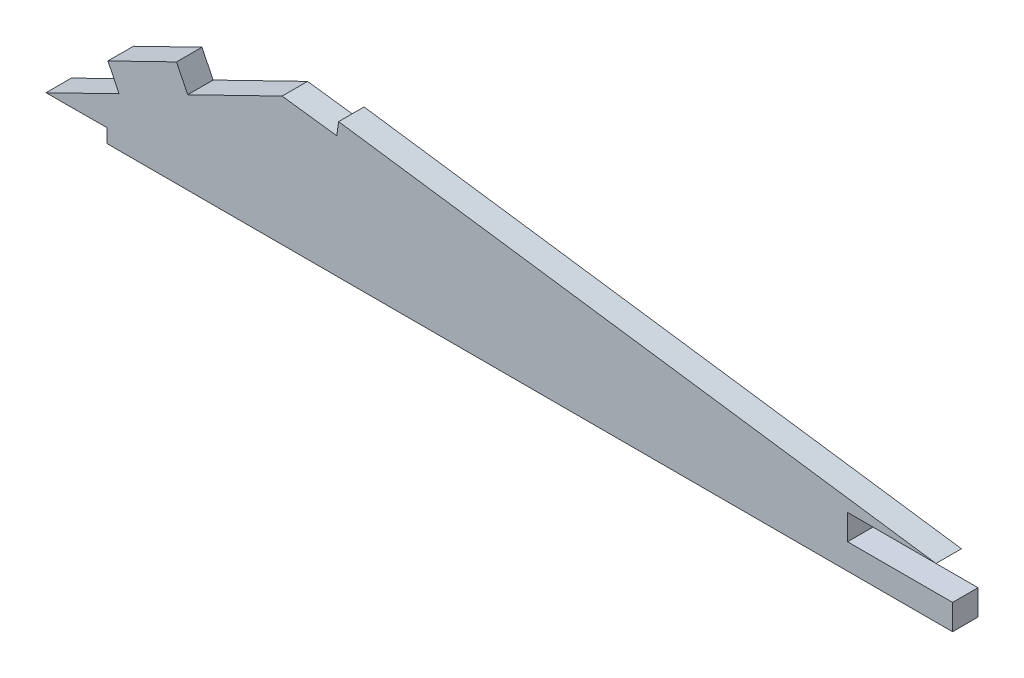
ISO-10303-21;
HEADER;
FILE_DESCRIPTION(('STEP AP214'),'2;1');
FILE_NAME('part.step','',(''),(''),'','','');
FILE_SCHEMA(('AUTOMOTIVE_DESIGN { 1 0 10303 214 1 1 1 1 }'));
ENDSEC;
DATA;
#1=APPLICATION_CONTEXT('core data for automotive mechanical design processes');
#2=APPLICATION_PROTOCOL_DEFINITION('international standard','automotive_design',2000,#1);
#3=PRODUCT_CONTEXT('',#1,'mechanical');
#4=PRODUCT('Part','Part','',(#3));
#5=PRODUCT_RELATED_PRODUCT_CATEGORY('part','',(#4));
#6=PRODUCT_DEFINITION_FORMATION('','',#4);
#7=PRODUCT_DEFINITION_CONTEXT('part definition',#1,'design');
#8=PRODUCT_DEFINITION('design','',#6,#7);
#9=PRODUCT_DEFINITION_SHAPE('','',#8);
#10=(LENGTH_UNIT() NAMED_UNIT(*) SI_UNIT(.MILLI.,.METRE.));
#11=(NAMED_UNIT(*) PLANE_ANGLE_UNIT() SI_UNIT($,.RADIAN.));
#12=(NAMED_UNIT(*) SI_UNIT($,.STERADIAN.) SOLID_ANGLE_UNIT());
#13=UNCERTAINTY_MEASURE_WITH_UNIT(LENGTH_MEASURE(1.E-05),#10,'distance_accuracy_value','');
#14=(GEOMETRIC_REPRESENTATION_CONTEXT(3) GLOBAL_UNCERTAINTY_ASSIGNED_CONTEXT((#13)) GLOBAL_UNIT_ASSIGNED_CONTEXT((#10,
#11,#12)) REPRESENTATION_CONTEXT('',''));
#15=CARTESIAN_POINT('',(0.,0.,0.));
#16=DIRECTION('',(0.,0.,1.));
#17=DIRECTION('',(1.,0.,0.));
#18=AXIS2_PLACEMENT_3D('',#15,#16,#17);
#19=CARTESIAN_POINT('',(7.7559861183291,7.19399602365428,2.));
#20=DIRECTION('',(0.438371146789037,-0.898794046299187,0.));
#21=DIRECTION('',(0.898794046299187,0.438371146789037,0.));
#22=AXIS2_PLACEMENT_3D('',#19,#20,#21);
#23=PLANE('',#22);
#24=DIRECTION('',(-0.898794046299187,-0.438371146789037,0.));
#25=VECTOR('',#24,1.);
#26=CARTESIAN_POINT('',(7.7559861183291,7.19399602365428,0.));
#27=LINE('',#26,#25);
#28=CARTESIAN_POINT('',(7.7559861183291,7.19399602365428,0.));
#29=VERTEX_POINT('',#28);
#30=CARTESIAN_POINT('',(2.0109844537902,4.39197149049386,0.));
#31=VERTEX_POINT('',#30);
#32=EDGE_CURVE('E172',#29,#31,#27,.T.);
#33=ORIENTED_EDGE('',*,*,#32,.T.);
#34=DIRECTION('',(0.,0.,-1.));
#35=VECTOR('',#34,1.);
#36=CARTESIAN_POINT('',(2.0109844537902,4.39197149049386,2.));
#37=LINE('',#36,#35);
#38=CARTESIAN_POINT('',(2.0109844537902,4.39197149049386,2.));
#39=VERTEX_POINT('',#38);
#40=EDGE_CURVE('E11',#39,#31,#37,.T.);
#41=ORIENTED_EDGE('',*,*,#40,.F.);
#42=DIRECTION('',(-0.898794046299187,-0.438371146789037,0.));
#43=VECTOR('',#42,1.);
#44=CARTESIAN_POINT('',(7.7559861183291,7.19399602365428,2.));
#45=LINE('',#44,#43);
#46=CARTESIAN_POINT('',(7.7559861183291,7.19399602365428,2.));
#47=VERTEX_POINT('',#46);
#48=EDGE_CURVE('E200',#47,#39,#45,.T.);
#49=ORIENTED_EDGE('',*,*,#48,.F.);
#50=DIRECTION('',(0.,0.,-1.));
#51=VECTOR('',#50,1.);
#52=CARTESIAN_POINT('',(7.7559861183291,7.19399602365428,2.));
#53=LINE('',#52,#51);
#54=EDGE_CURVE('E168',#47,#29,#53,.T.);
#55=ORIENTED_EDGE('',*,*,#54,.T.);
#56=EDGE_LOOP('',(#33,#41,#49,#55));
#57=FACE_BOUND('',#56,.T.);
#58=ADVANCED_FACE('F34',(#57),#23,.F.);
#59=CARTESIAN_POINT('',(6.79245025203826,4.41052776166242,2.));
#60=DIRECTION('',(-0.00388084579359947,0.999992469489609,0.));
#61=DIRECTION('',(-0.999992469489609,-0.00388084579359947,0.));
#62=AXIS2_PLACEMENT_3D('',#59,#60,#61);
#63=PLANE('',#62);
#64=DIRECTION('',(0.999992469489609,0.00388084579359947,0.));
#65=VECTOR('',#64,1.);
#66=CARTESIAN_POINT('',(6.79245025203826,4.41052776166242,0.));
#67=LINE('',#66,#65);
#68=CARTESIAN_POINT('',(6.79245025203826,4.41052776166242,0.));
#69=VERTEX_POINT('',#68);
#70=EDGE_CURVE('E175',#31,#69,#67,.T.);
#71=ORIENTED_EDGE('',*,*,#70,.T.);
#72=DIRECTION('',(0.,0.,-1.));
#73=VECTOR('',#72,1.);
#74=CARTESIAN_POINT('',(6.79245025203826,4.41052776166242,2.));
#75=LINE('',#74,#73);
#76=CARTESIAN_POINT('',(6.79245025203826,4.41052776166242,2.));
#77=VERTEX_POINT('',#76);
#78=EDGE_CURVE('E42',#77,#69,#75,.T.);
#79=ORIENTED_EDGE('',*,*,#78,.F.);
#80=DIRECTION('',(0.999992469489609,0.00388084579359947,0.));
#81=VECTOR('',#80,1.);
#82=CARTESIAN_POINT('',(6.79245025203826,4.41052776166242,2.));
#83=LINE('',#82,#81);
#84=EDGE_CURVE('E114',#39,#77,#83,.T.);
#85=ORIENTED_EDGE('',*,*,#84,.F.);
#86=ORIENTED_EDGE('',*,*,#40,.T.);
#87=EDGE_LOOP('',(#71,#79,#85,#86));
#88=FACE_BOUND('',#87,.T.);
#89=ADVANCED_FACE('F293',(#88),#63,.F.);
#90=CARTESIAN_POINT('',(6.79665387650502,3.32736366883972,2.));
#91=DIRECTION('',(0.999992469489616,0.00388084579166815,0.));
#92=DIRECTION('',(-0.00388084579166815,0.999992469489616,0.));
#93=AXIS2_PLACEMENT_3D('',#90,#91,#92);
#94=PLANE('',#93);
#95=DIRECTION('',(0.00388084579166815,-0.999992469489616,0.));
#96=VECTOR('',#95,1.);
#97=CARTESIAN_POINT('',(6.79665387650502,3.32736366883972,0.));
#98=LINE('',#97,#96);
#99=CARTESIAN_POINT('',(6.79665387650502,3.32736366883972,0.));
#100=VERTEX_POINT('',#99);
#101=EDGE_CURVE('E177',#69,#100,#98,.T.);
#102=ORIENTED_EDGE('',*,*,#101,.T.);
#103=DIRECTION('',(0.,0.,-1.));
#104=VECTOR('',#103,1.);
#105=CARTESIAN_POINT('',(6.79665387650502,3.32736366883972,2.));
#106=LINE('',#105,#104);
#107=CARTESIAN_POINT('',(6.79665387650502,3.32736366883972,2.));
#108=VERTEX_POINT('',#107);
#109=EDGE_CURVE('E228',#108,#100,#106,.T.);
#110=ORIENTED_EDGE('',*,*,#109,.F.);
#111=DIRECTION('',(0.00388084579166815,-0.999992469489616,0.));
#112=VECTOR('',#111,1.);
#113=CARTESIAN_POINT('',(6.79665387650502,3.32736366883972,2.));
#114=LINE('',#113,#112);
#115=EDGE_CURVE('E236',#77,#108,#114,.T.);
#116=ORIENTED_EDGE('',*,*,#115,.F.);
#117=ORIENTED_EDGE('',*,*,#78,.T.);
#118=EDGE_LOOP('',(#102,#110,#116,#117));
#119=FACE_BOUND('',#118,.T.);
#120=ADVANCED_FACE('F234',(#119),#94,.F.);
#121=CARTESIAN_POINT('',(6.79665387650502,3.32736366883972,2.));
#122=DIRECTION('',(0.,1.,0.));
#123=DIRECTION('',(0.,0.,1.));
#124=AXIS2_PLACEMENT_3D('',#121,#122,#123);
#125=PLANE('',#124);
#126=DIRECTION('',(1.,0.,0.));
#127=VECTOR('',#126,1.);
#128=CARTESIAN_POINT('',(6.79665387650502,3.32736366883972,0.));
#129=LINE('',#128,#127);
#130=CARTESIAN_POINT('',(73.2781243524124,3.32736366883972,0.));
#131=VERTEX_POINT('',#130);
#132=EDGE_CURVE('E179',#100,#131,#129,.T.);
#133=ORIENTED_EDGE('',*,*,#132,.T.);
#134=DIRECTION('',(0.,0.,-1.));
#135=VECTOR('',#134,1.);
#136=CARTESIAN_POINT('',(73.2781243524124,3.32736366883972,2.));
#137=LINE('',#136,#135);
#138=CARTESIAN_POINT('',(73.2781243524124,3.32736366883972,2.));
#139=VERTEX_POINT('',#138);
#140=EDGE_CURVE('E225',#139,#131,#137,.T.);
#141=ORIENTED_EDGE('',*,*,#140,.F.);
#142=DIRECTION('',(1.,0.,0.));
#143=VECTOR('',#142,1.);
#144=CARTESIAN_POINT('',(6.79665387650502,3.32736366883972,2.));
#145=LINE('',#144,#143);
#146=EDGE_CURVE('E254',#108,#139,#145,.T.);
#147=ORIENTED_EDGE('',*,*,#146,.F.);
#148=ORIENTED_EDGE('',*,*,#109,.T.);
#149=EDGE_LOOP('',(#133,#141,#147,#148));
#150=FACE_BOUND('',#149,.T.);
#151=ADVANCED_FACE('F245',(#150),#125,.F.);
#152=CARTESIAN_POINT('',(73.2781243524124,3.32736366883972,2.));
#153=DIRECTION('',(-1.,0.,0.));
#154=DIRECTION('',(0.,0.,1.));
#155=AXIS2_PLACEMENT_3D('',#152,#153,#154);
#156=PLANE('',#155);
#157=DIRECTION('',(0.,1.,0.));
#158=VECTOR('',#157,1.);
#159=CARTESIAN_POINT('',(73.2781243524124,3.32736366883972,0.));
#160=LINE('',#159,#158);
#161=CARTESIAN_POINT('',(73.2781243524124,5.32736366883972,0.));
#162=VERTEX_POINT('',#161);
#163=EDGE_CURVE('E181',#131,#162,#160,.T.);
#164=ORIENTED_EDGE('',*,*,#163,.T.);
#165=DIRECTION('',(0.,0.,-1.));
#166=VECTOR('',#165,1.);
#167=CARTESIAN_POINT('',(73.2781243524124,5.32736366883972,2.));
#168=LINE('',#167,#166);
#169=CARTESIAN_POINT('',(73.2781243524124,5.32736366883972,2.));
#170=VERTEX_POINT('',#169);
#171=EDGE_CURVE('E222',#170,#162,#168,.T.);
#172=ORIENTED_EDGE('',*,*,#171,.F.);
#173=DIRECTION('',(0.,1.,0.));
#174=VECTOR('',#173,1.);
#175=CARTESIAN_POINT('',(73.2781243524124,3.32736366883972,2.));
#176=LINE('',#175,#174);
#177=EDGE_CURVE('E251',#139,#170,#176,.T.);
#178=ORIENTED_EDGE('',*,*,#177,.F.);
#179=ORIENTED_EDGE('',*,*,#140,.T.);
#180=EDGE_LOOP('',(#164,#172,#178,#179));
#181=FACE_BOUND('',#180,.T.);
#182=ADVANCED_FACE('F249',(#181),#156,.F.);
#183=CARTESIAN_POINT('',(65.0219479564304,5.32736366883972,2.));
#184=DIRECTION('',(0.,-1.,0.));
#185=DIRECTION('',(0.,0.,-1.));
#186=AXIS2_PLACEMENT_3D('',#183,#184,#185);
#187=PLANE('',#186);
#188=DIRECTION('',(-1.,0.,0.));
#189=VECTOR('',#188,1.);
#190=CARTESIAN_POINT('',(65.0219479564304,5.32736366883972,0.));
#191=LINE('',#190,#189);
#192=CARTESIAN_POINT('',(65.0219479564304,5.32736366883972,0.));
#193=VERTEX_POINT('',#192);
#194=EDGE_CURVE('E183',#162,#193,#191,.T.);
#195=ORIENTED_EDGE('',*,*,#194,.T.);
#196=DIRECTION('',(0.,0.,-1.));
#197=VECTOR('',#196,1.);
#198=CARTESIAN_POINT('',(65.0219479564304,5.32736366883972,2.));
#199=LINE('',#198,#197);
#200=CARTESIAN_POINT('',(65.0219479564304,5.32736366883972,2.));
#201=VERTEX_POINT('',#200);
#202=EDGE_CURVE('E219',#201,#193,#199,.T.);
#203=ORIENTED_EDGE('',*,*,#202,.F.);
#204=DIRECTION('',(-1.,0.,0.));
#205=VECTOR('',#204,1.);
#206=CARTESIAN_POINT('',(65.0219479564304,5.32736366883972,2.));
#207=LINE('',#206,#205);
#208=EDGE_CURVE('E253',#170,#201,#207,.T.);
#209=ORIENTED_EDGE('',*,*,#208,.F.);
#210=ORIENTED_EDGE('',*,*,#171,.T.);
#211=EDGE_LOOP('',(#195,#203,#209,#210));
#212=FACE_BOUND('',#211,.T.);
#213=ADVANCED_FACE('F306',(#212),#187,.F.);
#214=CARTESIAN_POINT('',(65.0219479564304,5.32736366883972,2.));
#215=DIRECTION('',(-1.,0.,0.));
#216=DIRECTION('',(0.,0.,1.));
#217=AXIS2_PLACEMENT_3D('',#214,#215,#216);
#218=PLANE('',#217);
#219=DIRECTION('',(0.,1.,0.));
#220=VECTOR('',#219,1.);
#221=CARTESIAN_POINT('',(65.0219479564304,5.32736366883972,0.));
#222=LINE('',#221,#220);
#223=CARTESIAN_POINT('',(65.0219479564304,7.32736366884063,0.));
#224=VERTEX_POINT('',#223);
#225=EDGE_CURVE('E185',#193,#224,#222,.T.);
#226=ORIENTED_EDGE('',*,*,#225,.T.);
#227=DIRECTION('',(0.,0.,-1.));
#228=VECTOR('',#227,1.);
#229=CARTESIAN_POINT('',(65.0219479564304,7.32736366884063,2.));
#230=LINE('',#229,#228);
#231=CARTESIAN_POINT('',(65.0219479564304,7.32736366884063,2.));
#232=VERTEX_POINT('',#231);
#233=EDGE_CURVE('E216',#232,#224,#230,.T.);
#234=ORIENTED_EDGE('',*,*,#233,.F.);
#235=DIRECTION('',(0.,1.,0.));
#236=VECTOR('',#235,1.);
#237=CARTESIAN_POINT('',(65.0219479564304,5.32736366883972,2.));
#238=LINE('',#237,#236);
#239=EDGE_CURVE('E256',#201,#232,#238,.T.);
#240=ORIENTED_EDGE('',*,*,#239,.F.);
#241=ORIENTED_EDGE('',*,*,#202,.T.);
#242=EDGE_LOOP('',(#226,#234,#240,#241));
#243=FACE_BOUND('',#242,.T.);
#244=ADVANCED_FACE('F309',(#243),#218,.F.);
#245=CARTESIAN_POINT('',(65.0219479564304,7.32736366884063,2.));
#246=DIRECTION('',(0.,1.,0.));
#247=DIRECTION('',(0.,0.,1.));
#248=AXIS2_PLACEMENT_3D('',#245,#246,#247);
#249=PLANE('',#248);
#250=DIRECTION('',(1.,0.,0.));
#251=VECTOR('',#250,1.);
#252=CARTESIAN_POINT('',(65.0219479564304,7.32736366884063,0.));
#253=LINE('',#252,#251);
#254=CARTESIAN_POINT('',(71.9762860323582,7.32736366884063,0.));
#255=VERTEX_POINT('',#254);
#256=EDGE_CURVE('E187',#224,#255,#253,.T.);
#257=ORIENTED_EDGE('',*,*,#256,.T.);
#258=DIRECTION('',(0.,0.,-1.));
#259=VECTOR('',#258,1.);
#260=CARTESIAN_POINT('',(71.9762860323582,7.32736366884063,2.));
#261=LINE('',#260,#259);
#262=CARTESIAN_POINT('',(71.9762860323582,7.32736366884063,2.));
#263=VERTEX_POINT('',#262);
#264=EDGE_CURVE('E213',#263,#255,#261,.T.);
#265=ORIENTED_EDGE('',*,*,#264,.F.);
#266=DIRECTION('',(1.,0.,0.));
#267=VECTOR('',#266,1.);
#268=CARTESIAN_POINT('',(65.0219479564304,7.32736366884063,2.));
#269=LINE('',#268,#267);
#270=EDGE_CURVE('E262',#232,#263,#269,.T.);
#271=ORIENTED_EDGE('',*,*,#270,.F.);
#272=ORIENTED_EDGE('',*,*,#233,.T.);
#273=EDGE_LOOP('',(#257,#265,#271,#272));
#274=FACE_BOUND('',#273,.T.);
#275=ADVANCED_FACE('F313',(#274),#249,.F.);
#276=CARTESIAN_POINT('',(25.0150673189929,13.9273325454594,2.));
#277=DIRECTION('',(-0.139173100960082,-0.990268068741568,0.));
#278=DIRECTION('',(0.990268068741568,-0.139173100960082,0.));
#279=AXIS2_PLACEMENT_3D('',#276,#277,#278);
#280=PLANE('',#279);
#281=DIRECTION('',(-0.990268068741568,0.139173100960082,0.));
#282=VECTOR('',#281,1.);
#283=CARTESIAN_POINT('',(25.0150673189929,13.9273325454594,0.));
#284=LINE('',#283,#282);
#285=CARTESIAN_POINT('',(25.0150673189929,13.9273325454594,0.));
#286=VERTEX_POINT('',#285);
#287=EDGE_CURVE('E189',#255,#286,#284,.T.);
#288=ORIENTED_EDGE('',*,*,#287,.T.);
#289=DIRECTION('',(0.,0.,-1.));
#290=VECTOR('',#289,1.);
#291=CARTESIAN_POINT('',(25.0150673189929,13.9273325454594,2.));
#292=LINE('',#291,#290);
#293=CARTESIAN_POINT('',(25.0150673189929,13.9273325454594,2.));
#294=VERTEX_POINT('',#293);
#295=EDGE_CURVE('E210',#294,#286,#292,.T.);
#296=ORIENTED_EDGE('',*,*,#295,.F.);
#297=DIRECTION('',(-0.990268068741568,0.139173100960082,0.));
#298=VECTOR('',#297,1.);
#299=CARTESIAN_POINT('',(25.0150673189929,13.9273325454594,2.));
#300=LINE('',#299,#298);
#301=EDGE_CURVE('E264',#263,#294,#300,.T.);
#302=ORIENTED_EDGE('',*,*,#301,.F.);
#303=ORIENTED_EDGE('',*,*,#264,.T.);
#304=EDGE_LOOP('',(#288,#296,#302,#303));
#305=FACE_BOUND('',#304,.T.);
#306=ADVANCED_FACE('F317',(#305),#280,.F.);
#307=CARTESIAN_POINT('',(24.8668572662019,12.8896402880047,2.));
#308=DIRECTION('',(0.98995372681901,-0.141391720963968,0.));
#309=DIRECTION('',(0.141391720963968,0.98995372681901,0.));
#310=AXIS2_PLACEMENT_3D('',#307,#308,#309);
#311=PLANE('',#310);
#312=DIRECTION('',(-0.141391720963968,-0.98995372681901,0.));
#313=VECTOR('',#312,1.);
#314=CARTESIAN_POINT('',(24.8668572662019,12.8896402880047,0.));
#315=LINE('',#314,#313);
#316=CARTESIAN_POINT('',(24.8668572662019,12.8896402880047,0.));
#317=VERTEX_POINT('',#316);
#318=EDGE_CURVE('E191',#286,#317,#315,.T.);
#319=ORIENTED_EDGE('',*,*,#318,.T.);
#320=DIRECTION('',(0.,0.,-1.));
#321=VECTOR('',#320,1.);
#322=CARTESIAN_POINT('',(24.8668572662019,12.8896402880047,2.));
#323=LINE('',#322,#321);
#324=CARTESIAN_POINT('',(24.8668572662019,12.8896402880047,2.));
#325=VERTEX_POINT('',#324);
#326=EDGE_CURVE('E207',#325,#317,#323,.T.);
#327=ORIENTED_EDGE('',*,*,#326,.F.);
#328=DIRECTION('',(-0.141391720963968,-0.98995372681901,0.));
#329=VECTOR('',#328,1.);
#330=CARTESIAN_POINT('',(24.8668572662019,12.8896402880047,2.));
#331=LINE('',#330,#329);
#332=EDGE_CURVE('E266',#294,#325,#331,.T.);
#333=ORIENTED_EDGE('',*,*,#332,.F.);
#334=ORIENTED_EDGE('',*,*,#295,.T.);
#335=EDGE_LOOP('',(#319,#327,#333,#334));
#336=FACE_BOUND('',#335,.T.);
#337=ADVANCED_FACE('F321',(#336),#311,.F.);
#338=CARTESIAN_POINT('',(20.5726316428309,13.4450917220517,2.));
#339=DIRECTION('',(-0.128279776916158,-0.991738019254249,0.));
#340=DIRECTION('',(0.991738019254249,-0.128279776916158,0.));
#341=AXIS2_PLACEMENT_3D('',#338,#339,#340);
#342=PLANE('',#341);
#343=DIRECTION('',(-0.991738019254249,0.128279776916158,0.));
#344=VECTOR('',#343,1.);
#345=CARTESIAN_POINT('',(20.5726316428309,13.4450917220517,0.));
#346=LINE('',#345,#344);
#347=CARTESIAN_POINT('',(20.5726316428309,13.4450917220517,0.));
#348=VERTEX_POINT('',#347);
#349=EDGE_CURVE('E193',#317,#348,#346,.T.);
#350=ORIENTED_EDGE('',*,*,#349,.T.);
#351=DIRECTION('',(0.,0.,-1.));
#352=VECTOR('',#351,1.);
#353=CARTESIAN_POINT('',(20.5726316428309,13.4450917220517,2.));
#354=LINE('',#353,#352);
#355=CARTESIAN_POINT('',(20.5726316428309,13.4450917220517,2.));
#356=VERTEX_POINT('',#355);
#357=EDGE_CURVE('E204',#356,#348,#354,.T.);
#358=ORIENTED_EDGE('',*,*,#357,.F.);
#359=DIRECTION('',(-0.991738019254249,0.128279776916158,0.));
#360=VECTOR('',#359,1.);
#361=CARTESIAN_POINT('',(20.5726316428309,13.4450917220517,2.));
#362=LINE('',#361,#360);
#363=EDGE_CURVE('E268',#325,#356,#362,.T.);
#364=ORIENTED_EDGE('',*,*,#363,.F.);
#365=ORIENTED_EDGE('',*,*,#326,.T.);
#366=EDGE_LOOP('',(#350,#358,#364,#365));
#367=FACE_BOUND('',#366,.T.);
#368=ADVANCED_FACE('F274',(#367),#342,.F.);
#369=CARTESIAN_POINT('',(13.1487503961244,9.82422290438871,2.));
#370=DIRECTION('',(0.438371146789202,-0.898794046299106,0.));
#371=DIRECTION('',(0.898794046299106,0.438371146789202,0.));
#372=AXIS2_PLACEMENT_3D('',#369,#370,#371);
#373=PLANE('',#372);
#374=DIRECTION('',(-0.898794046299106,-0.438371146789202,0.));
#375=VECTOR('',#374,1.);
#376=CARTESIAN_POINT('',(13.1487503961244,9.82422290438871,0.));
#377=LINE('',#376,#375);
#378=CARTESIAN_POINT('',(13.1487503961244,9.82422290438871,0.));
#379=VERTEX_POINT('',#378);
#380=EDGE_CURVE('E195',#348,#379,#377,.T.);
#381=ORIENTED_EDGE('',*,*,#380,.T.);
#382=DIRECTION('',(0.,0.,-1.));
#383=VECTOR('',#382,1.);
#384=CARTESIAN_POINT('',(13.1487503961244,9.82422290438871,2.));
#385=LINE('',#384,#383);
#386=CARTESIAN_POINT('',(13.1487503961244,9.82422290438871,2.));
#387=VERTEX_POINT('',#386);
#388=EDGE_CURVE('E163',#387,#379,#385,.T.);
#389=ORIENTED_EDGE('',*,*,#388,.F.);
#390=DIRECTION('',(-0.898794046299106,-0.438371146789202,0.));
#391=VECTOR('',#390,1.);
#392=CARTESIAN_POINT('',(13.1487503961244,9.82422290438871,2.));
#393=LINE('',#392,#391);
#394=EDGE_CURVE('E154',#356,#387,#393,.T.);
#395=ORIENTED_EDGE('',*,*,#394,.F.);
#396=ORIENTED_EDGE('',*,*,#357,.T.);
#397=EDGE_LOOP('',(#381,#389,#395,#396));
#398=FACE_BOUND('',#397,.T.);
#399=ADVANCED_FACE('F278',(#398),#373,.F.);
#400=CARTESIAN_POINT('',(12.2720081025464,11.6218109969874,2.));
#401=DIRECTION('',(-0.898794046299239,-0.43837114678893,0.));
#402=DIRECTION('',(0.43837114678893,-0.898794046299239,0.));
#403=AXIS2_PLACEMENT_3D('',#400,#401,#402);
#404=PLANE('',#403);
#405=DIRECTION('',(-0.43837114678893,0.898794046299239,0.));
#406=VECTOR('',#405,1.);
#407=CARTESIAN_POINT('',(12.2720081025464,11.6218109969874,0.));
#408=LINE('',#407,#406);
#409=CARTESIAN_POINT('',(12.2720081025464,11.6218109969874,0.));
#410=VERTEX_POINT('',#409);
#411=EDGE_CURVE('E162',#379,#410,#408,.T.);
#412=ORIENTED_EDGE('',*,*,#411,.T.);
#413=DIRECTION('',(0.,0.,-1.));
#414=VECTOR('',#413,1.);
#415=CARTESIAN_POINT('',(12.2720081025464,11.6218109969874,2.));
#416=LINE('',#415,#414);
#417=CARTESIAN_POINT('',(12.2720081025464,11.6218109969874,2.));
#418=VERTEX_POINT('',#417);
#419=EDGE_CURVE('E159',#418,#410,#416,.T.);
#420=ORIENTED_EDGE('',*,*,#419,.F.);
#421=DIRECTION('',(-0.43837114678893,0.898794046299239,0.));
#422=VECTOR('',#421,1.);
#423=CARTESIAN_POINT('',(12.2720081025464,11.6218109969874,2.));
#424=LINE('',#423,#422);
#425=EDGE_CURVE('E148',#387,#418,#424,.T.);
#426=ORIENTED_EDGE('',*,*,#425,.F.);
#427=ORIENTED_EDGE('',*,*,#388,.T.);
#428=EDGE_LOOP('',(#412,#420,#426,#427));
#429=FACE_BOUND('',#428,.T.);
#430=ADVANCED_FACE('F160',(#429),#404,.F.);
#431=CARTESIAN_POINT('',(6.87924382475112,8.99158411625302,2.));
#432=DIRECTION('',(0.438371146789051,-0.89879404629918,0.));
#433=DIRECTION('',(0.89879404629918,0.438371146789051,0.));
#434=AXIS2_PLACEMENT_3D('',#431,#432,#433);
#435=PLANE('',#434);
#436=DIRECTION('',(-0.89879404629918,-0.438371146789051,0.));
#437=VECTOR('',#436,1.);
#438=CARTESIAN_POINT('',(6.87924382475112,8.99158411625302,0.));
#439=LINE('',#438,#437);
#440=CARTESIAN_POINT('',(6.87924382475112,8.99158411625302,0.));
#441=VERTEX_POINT('',#440);
#442=EDGE_CURVE('E100',#410,#441,#439,.T.);
#443=ORIENTED_EDGE('',*,*,#442,.T.);
#444=DIRECTION('',(0.,0.,-1.));
#445=VECTOR('',#444,1.);
#446=CARTESIAN_POINT('',(6.87924382475112,8.99158411625302,2.));
#447=LINE('',#446,#445);
#448=CARTESIAN_POINT('',(6.87924382475112,8.99158411625302,2.));
#449=VERTEX_POINT('',#448);
#450=EDGE_CURVE('E164',#449,#441,#447,.T.);
#451=ORIENTED_EDGE('',*,*,#450,.F.);
#452=DIRECTION('',(-0.89879404629918,-0.438371146789051,0.));
#453=VECTOR('',#452,1.);
#454=CARTESIAN_POINT('',(6.87924382475112,8.99158411625302,2.));
#455=LINE('',#454,#453);
#456=EDGE_CURVE('E152',#418,#449,#455,.T.);
#457=ORIENTED_EDGE('',*,*,#456,.F.);
#458=ORIENTED_EDGE('',*,*,#419,.T.);
#459=EDGE_LOOP('',(#443,#451,#457,#458));
#460=FACE_BOUND('',#459,.T.);
#461=ADVANCED_FACE('F166',(#460),#435,.F.);
#462=CARTESIAN_POINT('',(7.7559861183291,7.19399602365428,2.));
#463=DIRECTION('',(0.898794046299239,0.43837114678893,0.));
#464=DIRECTION('',(-0.43837114678893,0.898794046299239,0.));
#465=AXIS2_PLACEMENT_3D('',#462,#463,#464);
#466=PLANE('',#465);
#467=DIRECTION('',(0.43837114678893,-0.898794046299239,0.));
#468=VECTOR('',#467,1.);
#469=CARTESIAN_POINT('',(7.7559861183291,7.19399602365428,0.));
#470=LINE('',#469,#468);
#471=EDGE_CURVE('E106',#441,#29,#470,.T.);
#472=ORIENTED_EDGE('',*,*,#471,.T.);
#473=ORIENTED_EDGE('',*,*,#54,.F.);
#474=DIRECTION('',(0.43837114678893,-0.898794046299239,0.));
#475=VECTOR('',#474,1.);
#476=CARTESIAN_POINT('',(7.7559861183291,7.19399602365428,2.));
#477=LINE('',#476,#475);
#478=EDGE_CURVE('E50',#449,#47,#477,.T.);
#479=ORIENTED_EDGE('',*,*,#478,.F.);
#480=ORIENTED_EDGE('',*,*,#450,.T.);
#481=EDGE_LOOP('',(#472,#473,#479,#480));
#482=FACE_BOUND('',#481,.T.);
#483=ADVANCED_FACE('F282',(#482),#466,.F.);
#484=CARTESIAN_POINT('',(0.,0.,2.));
#485=DIRECTION('',(0.,0.,1.));
#486=DIRECTION('',(1.,0.,0.));
#487=AXIS2_PLACEMENT_3D('',#484,#485,#486);
#488=PLANE('',#487);
#489=ORIENTED_EDGE('',*,*,#48,.T.);
#490=ORIENTED_EDGE('',*,*,#84,.T.);
#491=ORIENTED_EDGE('',*,*,#115,.T.);
#492=ORIENTED_EDGE('',*,*,#146,.T.);
#493=ORIENTED_EDGE('',*,*,#177,.T.);
#494=ORIENTED_EDGE('',*,*,#208,.T.);
#495=ORIENTED_EDGE('',*,*,#239,.T.);
#496=ORIENTED_EDGE('',*,*,#270,.T.);
#497=ORIENTED_EDGE('',*,*,#301,.T.);
#498=ORIENTED_EDGE('',*,*,#332,.T.);
#499=ORIENTED_EDGE('',*,*,#363,.T.);
#500=ORIENTED_EDGE('',*,*,#394,.T.);
#501=ORIENTED_EDGE('',*,*,#425,.T.);
#502=ORIENTED_EDGE('',*,*,#456,.T.);
#503=ORIENTED_EDGE('',*,*,#478,.T.);
#504=EDGE_LOOP('',(#489,#490,#491,#492,#493,#494,#495,#496,#497,#498,#499,#500,#501,#502,#503));
#505=FACE_BOUND('',#504,.T.);
#506=ADVANCED_FACE('F150',(#505),#488,.T.);
#507=CARTESIAN_POINT('',(0.,0.,0.));
#508=DIRECTION('',(0.,0.,1.));
#509=DIRECTION('',(1.,0.,0.));
#510=AXIS2_PLACEMENT_3D('',#507,#508,#509);
#511=PLANE('',#510);
#512=ORIENTED_EDGE('',*,*,#32,.F.);
#513=ORIENTED_EDGE('',*,*,#471,.F.);
#514=ORIENTED_EDGE('',*,*,#442,.F.);
#515=ORIENTED_EDGE('',*,*,#411,.F.);
#516=ORIENTED_EDGE('',*,*,#380,.F.);
#517=ORIENTED_EDGE('',*,*,#349,.F.);
#518=ORIENTED_EDGE('',*,*,#318,.F.);
#519=ORIENTED_EDGE('',*,*,#287,.F.);
#520=ORIENTED_EDGE('',*,*,#256,.F.);
#521=ORIENTED_EDGE('',*,*,#225,.F.);
#522=ORIENTED_EDGE('',*,*,#194,.F.);
#523=ORIENTED_EDGE('',*,*,#163,.F.);
#524=ORIENTED_EDGE('',*,*,#132,.F.);
#525=ORIENTED_EDGE('',*,*,#101,.F.);
#526=ORIENTED_EDGE('',*,*,#70,.F.);
#527=EDGE_LOOP('',(#512,#513,#514,#515,#516,#517,#518,#519,#520,#521,#522,#523,#524,#525,#526));
#528=FACE_BOUND('',#527,.T.);
#529=ADVANCED_FACE('F240',(#528),#511,.F.);
#530=CLOSED_SHELL('',(#58,#89,#120,#151,#182,#213,#244,#275,#306,#337,#368,#399,#430,#461,#483,
#506,#529));
#531=MANIFOLD_SOLID_BREP('B2',#530);
#532=ADVANCED_BREP_SHAPE_REPRESENTATION('',(#18,#531),#14);
#533=SHAPE_DEFINITION_REPRESENTATION(#9,#532);
ENDSEC;
END-ISO-10303-21;
